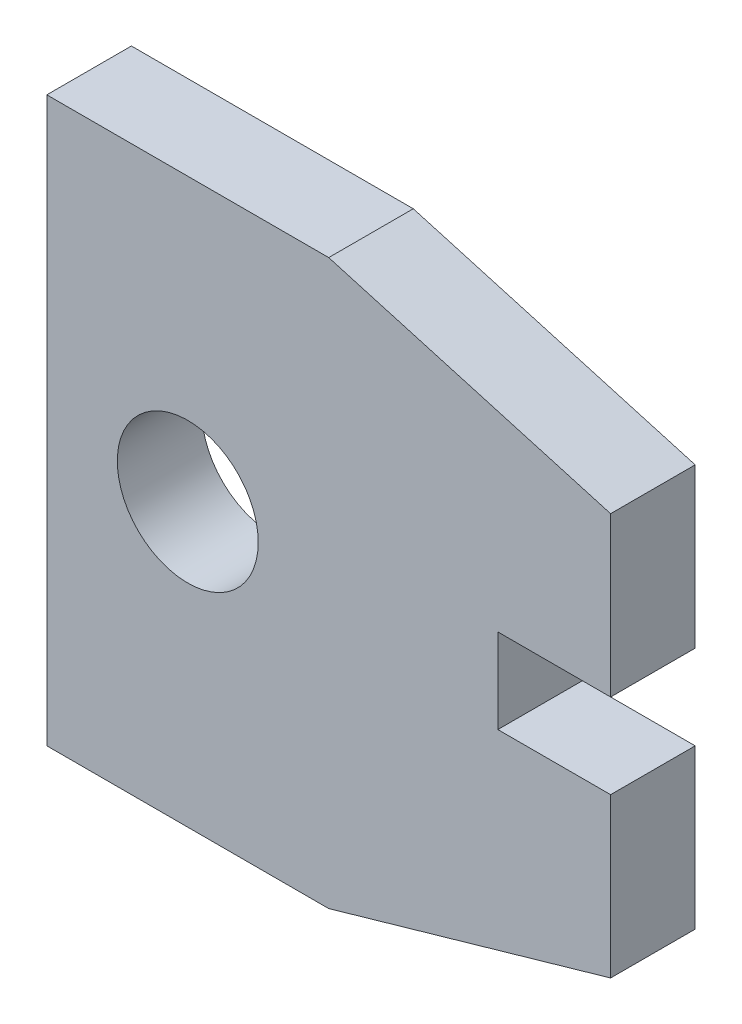
ISO-10303-21;
HEADER;
FILE_DESCRIPTION(('STEP AP214'),'2;1');
FILE_NAME('part.step','',(''),(''),'','','');
FILE_SCHEMA(('AUTOMOTIVE_DESIGN { 1 0 10303 214 1 1 1 1 }'));
ENDSEC;
DATA;
#1=APPLICATION_CONTEXT('core data for automotive mechanical design processes');
#2=APPLICATION_PROTOCOL_DEFINITION('international standard','automotive_design',2000,#1);
#3=PRODUCT_CONTEXT('',#1,'mechanical');
#4=PRODUCT('Part','Part','',(#3));
#5=PRODUCT_RELATED_PRODUCT_CATEGORY('part','',(#4));
#6=PRODUCT_DEFINITION_FORMATION('','',#4);
#7=PRODUCT_DEFINITION_CONTEXT('part definition',#1,'design');
#8=PRODUCT_DEFINITION('design','',#6,#7);
#9=PRODUCT_DEFINITION_SHAPE('','',#8);
#10=(LENGTH_UNIT() NAMED_UNIT(*) SI_UNIT(.MILLI.,.METRE.));
#11=(NAMED_UNIT(*) PLANE_ANGLE_UNIT() SI_UNIT($,.RADIAN.));
#12=(NAMED_UNIT(*) SI_UNIT($,.STERADIAN.) SOLID_ANGLE_UNIT());
#13=UNCERTAINTY_MEASURE_WITH_UNIT(LENGTH_MEASURE(1.E-05),#10,'distance_accuracy_value','');
#14=(GEOMETRIC_REPRESENTATION_CONTEXT(3) GLOBAL_UNCERTAINTY_ASSIGNED_CONTEXT((#13)) GLOBAL_UNIT_ASSIGNED_CONTEXT((#10,
#11,#12)) REPRESENTATION_CONTEXT('',''));
#15=CARTESIAN_POINT('',(0.,0.,0.));
#16=DIRECTION('',(0.,0.,1.));
#17=DIRECTION('',(1.,0.,0.));
#18=AXIS2_PLACEMENT_3D('',#15,#16,#17);
#19=CARTESIAN_POINT('',(0.,0.,3.));
#20=DIRECTION('',(0.,0.,1.));
#21=DIRECTION('',(1.,0.,0.));
#22=AXIS2_PLACEMENT_3D('',#19,#20,#21);
#23=PLANE('',#22);
#24=DIRECTION('',(0.,-1.,0.));
#25=VECTOR('',#24,1.);
#26=CARTESIAN_POINT('',(6.,1.5,3.));
#27=LINE('',#26,#25);
#28=CARTESIAN_POINT('',(6.,1.5,3.));
#29=VERTEX_POINT('',#28);
#30=CARTESIAN_POINT('',(6.,-1.5,3.));
#31=VERTEX_POINT('',#30);
#32=EDGE_CURVE('E206',#29,#31,#27,.T.);
#33=ORIENTED_EDGE('',*,*,#32,.F.);
#34=DIRECTION('',(-1.,0.,0.));
#35=VECTOR('',#34,1.);
#36=CARTESIAN_POINT('',(10.,1.5,3.));
#37=LINE('',#36,#35);
#38=CARTESIAN_POINT('',(10.,1.5,3.));
#39=VERTEX_POINT('',#38);
#40=EDGE_CURVE('E110',#39,#29,#37,.T.);
#41=ORIENTED_EDGE('',*,*,#40,.F.);
#42=DIRECTION('',(0.,1.,0.));
#43=VECTOR('',#42,1.);
#44=CARTESIAN_POINT('',(10.,7.13254614241191,3.));
#45=LINE('',#44,#43);
#46=CARTESIAN_POINT('',(10.,7.13254614241191,3.));
#47=VERTEX_POINT('',#46);
#48=EDGE_CURVE('E102',#39,#47,#45,.T.);
#49=ORIENTED_EDGE('',*,*,#48,.T.);
#50=DIRECTION('',(-0.961261695938318,0.275637355817,0.));
#51=VECTOR('',#50,1.);
#52=CARTESIAN_POINT('',(0.,10.,3.));
#53=LINE('',#52,#51);
#54=CARTESIAN_POINT('',(0.,10.,3.));
#55=VERTEX_POINT('',#54);
#56=EDGE_CURVE('E107',#47,#55,#53,.T.);
#57=ORIENTED_EDGE('',*,*,#56,.T.);
#58=DIRECTION('',(-1.,0.,0.));
#59=VECTOR('',#58,1.);
#60=CARTESIAN_POINT('',(-10.,10.,3.));
#61=LINE('',#60,#59);
#62=CARTESIAN_POINT('',(-10.,10.,3.));
#63=VERTEX_POINT('',#62);
#64=EDGE_CURVE('E56',#55,#63,#61,.T.);
#65=ORIENTED_EDGE('',*,*,#64,.T.);
#66=DIRECTION('',(0.,-1.,0.));
#67=VECTOR('',#66,1.);
#68=CARTESIAN_POINT('',(-10.,10.,3.));
#69=LINE('',#68,#67);
#70=CARTESIAN_POINT('',(-10.,-10.,3.));
#71=VERTEX_POINT('',#70);
#72=EDGE_CURVE('E147',#63,#71,#69,.T.);
#73=ORIENTED_EDGE('',*,*,#72,.T.);
#74=DIRECTION('',(1.,0.,0.));
#75=VECTOR('',#74,1.);
#76=CARTESIAN_POINT('',(-10.,-10.,3.));
#77=LINE('',#76,#75);
#78=CARTESIAN_POINT('',(0.,-10.,3.));
#79=VERTEX_POINT('',#78);
#80=EDGE_CURVE('E91',#71,#79,#77,.T.);
#81=ORIENTED_EDGE('',*,*,#80,.T.);
#82=DIRECTION('',(0.961261695938319,0.275637355817,0.));
#83=VECTOR('',#82,1.);
#84=CARTESIAN_POINT('',(0.,-10.,3.));
#85=LINE('',#84,#83);
#86=CARTESIAN_POINT('',(10.,-7.13254614241191,3.));
#87=VERTEX_POINT('',#86);
#88=EDGE_CURVE('E157',#79,#87,#85,.T.);
#89=ORIENTED_EDGE('',*,*,#88,.T.);
#90=DIRECTION('',(0.,1.,0.));
#91=VECTOR('',#90,1.);
#92=CARTESIAN_POINT('',(10.,-2.5,3.));
#93=LINE('',#92,#91);
#94=CARTESIAN_POINT('',(10.,-1.5,3.));
#95=VERTEX_POINT('',#94);
#96=EDGE_CURVE('E114',#87,#95,#93,.T.);
#97=ORIENTED_EDGE('',*,*,#96,.T.);
#98=DIRECTION('',(1.,0.,0.));
#99=VECTOR('',#98,1.);
#100=CARTESIAN_POINT('',(10.,-1.5,3.));
#101=LINE('',#100,#99);
#102=EDGE_CURVE('E179',#31,#95,#101,.T.);
#103=ORIENTED_EDGE('',*,*,#102,.F.);
#104=EDGE_LOOP('',(#33,#41,#49,#57,#65,#73,#81,#89,#97,#103));
#105=FACE_BOUND('',#104,.T.);
#106=CARTESIAN_POINT('',(-5.,0.,3.));
#107=DIRECTION('',(0.,0.,1.));
#108=DIRECTION('',(1.,0.,0.));
#109=AXIS2_PLACEMENT_3D('',#106,#107,#108);
#110=CIRCLE('',#109,2.5);
#111=CARTESIAN_POINT('',(-2.5,0.,3.));
#112=VERTEX_POINT('',#111);
#113=EDGE_CURVE('E136',#112,#112,#110,.T.);
#114=ORIENTED_EDGE('',*,*,#113,.F.);
#115=EDGE_LOOP('',(#114));
#116=FACE_BOUND('',#115,.T.);
#117=ADVANCED_FACE('F32',(#105,#116),#23,.T.);
#118=CARTESIAN_POINT('',(0.,0.,0.));
#119=DIRECTION('',(0.,0.,1.));
#120=DIRECTION('',(1.,0.,0.));
#121=AXIS2_PLACEMENT_3D('',#118,#119,#120);
#122=PLANE('',#121);
#123=DIRECTION('',(-1.,0.,0.));
#124=VECTOR('',#123,1.);
#125=CARTESIAN_POINT('',(10.,1.5,0.));
#126=LINE('',#125,#124);
#127=CARTESIAN_POINT('',(10.,1.5,0.));
#128=VERTEX_POINT('',#127);
#129=CARTESIAN_POINT('',(6.,1.5,0.));
#130=VERTEX_POINT('',#129);
#131=EDGE_CURVE('E181',#128,#130,#126,.T.);
#132=ORIENTED_EDGE('',*,*,#131,.T.);
#133=DIRECTION('',(0.,-1.,0.));
#134=VECTOR('',#133,1.);
#135=CARTESIAN_POINT('',(6.,1.5,0.));
#136=LINE('',#135,#134);
#137=CARTESIAN_POINT('',(6.,-1.5,0.));
#138=VERTEX_POINT('',#137);
#139=EDGE_CURVE('E47',#130,#138,#136,.T.);
#140=ORIENTED_EDGE('',*,*,#139,.T.);
#141=DIRECTION('',(1.,0.,0.));
#142=VECTOR('',#141,1.);
#143=CARTESIAN_POINT('',(10.,-1.5,0.));
#144=LINE('',#143,#142);
#145=CARTESIAN_POINT('',(10.,-1.5,0.));
#146=VERTEX_POINT('',#145);
#147=EDGE_CURVE('E164',#138,#146,#144,.T.);
#148=ORIENTED_EDGE('',*,*,#147,.T.);
#149=DIRECTION('',(0.,1.,0.));
#150=VECTOR('',#149,1.);
#151=CARTESIAN_POINT('',(10.,-2.5,0.));
#152=LINE('',#151,#150);
#153=CARTESIAN_POINT('',(10.,-7.13254614241191,0.));
#154=VERTEX_POINT('',#153);
#155=EDGE_CURVE('E140',#154,#146,#152,.T.);
#156=ORIENTED_EDGE('',*,*,#155,.F.);
#157=DIRECTION('',(0.961261695938319,0.275637355817,0.));
#158=VECTOR('',#157,1.);
#159=CARTESIAN_POINT('',(0.,-10.,0.));
#160=LINE('',#159,#158);
#161=CARTESIAN_POINT('',(0.,-10.,0.));
#162=VERTEX_POINT('',#161);
#163=EDGE_CURVE('E138',#162,#154,#160,.T.);
#164=ORIENTED_EDGE('',*,*,#163,.F.);
#165=DIRECTION('',(1.,0.,0.));
#166=VECTOR('',#165,1.);
#167=CARTESIAN_POINT('',(-10.,-10.,0.));
#168=LINE('',#167,#166);
#169=CARTESIAN_POINT('',(-10.,-10.,0.));
#170=VERTEX_POINT('',#169);
#171=EDGE_CURVE('E135',#170,#162,#168,.T.);
#172=ORIENTED_EDGE('',*,*,#171,.F.);
#173=DIRECTION('',(0.,-1.,0.));
#174=VECTOR('',#173,1.);
#175=CARTESIAN_POINT('',(-10.,10.,0.));
#176=LINE('',#175,#174);
#177=CARTESIAN_POINT('',(-10.,10.,0.));
#178=VERTEX_POINT('',#177);
#179=EDGE_CURVE('E132',#178,#170,#176,.T.);
#180=ORIENTED_EDGE('',*,*,#179,.F.);
#181=DIRECTION('',(-1.,0.,0.));
#182=VECTOR('',#181,1.);
#183=CARTESIAN_POINT('',(-10.,10.,0.));
#184=LINE('',#183,#182);
#185=CARTESIAN_POINT('',(0.,10.,0.));
#186=VERTEX_POINT('',#185);
#187=EDGE_CURVE('E83',#186,#178,#184,.T.);
#188=ORIENTED_EDGE('',*,*,#187,.F.);
#189=DIRECTION('',(-0.961261695938318,0.275637355817,0.));
#190=VECTOR('',#189,1.);
#191=CARTESIAN_POINT('',(0.,10.,0.));
#192=LINE('',#191,#190);
#193=CARTESIAN_POINT('',(10.,7.13254614241191,0.));
#194=VERTEX_POINT('',#193);
#195=EDGE_CURVE('E144',#194,#186,#192,.T.);
#196=ORIENTED_EDGE('',*,*,#195,.F.);
#197=DIRECTION('',(0.,1.,0.));
#198=VECTOR('',#197,1.);
#199=CARTESIAN_POINT('',(10.,7.13254614241191,0.));
#200=LINE('',#199,#198);
#201=EDGE_CURVE('E120',#128,#194,#200,.T.);
#202=ORIENTED_EDGE('',*,*,#201,.F.);
#203=EDGE_LOOP('',(#132,#140,#148,#156,#164,#172,#180,#188,#196,#202));
#204=FACE_BOUND('',#203,.T.);
#205=CARTESIAN_POINT('',(-5.,0.,0.));
#206=DIRECTION('',(0.,0.,1.));
#207=DIRECTION('',(1.,0.,0.));
#208=AXIS2_PLACEMENT_3D('',#205,#206,#207);
#209=CIRCLE('',#208,2.5);
#210=CARTESIAN_POINT('',(-2.5,0.,0.));
#211=VERTEX_POINT('',#210);
#212=EDGE_CURVE('E190',#211,#211,#209,.T.);
#213=ORIENTED_EDGE('',*,*,#212,.T.);
#214=EDGE_LOOP('',(#213));
#215=FACE_BOUND('',#214,.T.);
#216=ADVANCED_FACE('F159',(#204,#215),#122,.F.);
#217=CARTESIAN_POINT('',(-10.,10.,3.));
#218=DIRECTION('',(1.,0.,0.));
#219=DIRECTION('',(0.,1.,0.));
#220=AXIS2_PLACEMENT_3D('',#217,#218,#219);
#221=PLANE('',#220);
#222=ORIENTED_EDGE('',*,*,#179,.T.);
#223=DIRECTION('',(0.,0.,-1.));
#224=VECTOR('',#223,1.);
#225=CARTESIAN_POINT('',(-10.,-10.,3.));
#226=LINE('',#225,#224);
#227=EDGE_CURVE('E11',#71,#170,#226,.T.);
#228=ORIENTED_EDGE('',*,*,#227,.F.);
#229=ORIENTED_EDGE('',*,*,#72,.F.);
#230=DIRECTION('',(0.,0.,-1.));
#231=VECTOR('',#230,1.);
#232=CARTESIAN_POINT('',(-10.,10.,3.));
#233=LINE('',#232,#231);
#234=EDGE_CURVE('E128',#63,#178,#233,.T.);
#235=ORIENTED_EDGE('',*,*,#234,.T.);
#236=EDGE_LOOP('',(#222,#228,#229,#235));
#237=FACE_BOUND('',#236,.T.);
#238=ADVANCED_FACE('F34',(#237),#221,.F.);
#239=CARTESIAN_POINT('',(-10.,-10.,3.));
#240=DIRECTION('',(0.,1.,0.));
#241=DIRECTION('',(0.,0.,1.));
#242=AXIS2_PLACEMENT_3D('',#239,#240,#241);
#243=PLANE('',#242);
#244=ORIENTED_EDGE('',*,*,#171,.T.);
#245=DIRECTION('',(0.,0.,-1.));
#246=VECTOR('',#245,1.);
#247=CARTESIAN_POINT('',(0.,-10.,3.));
#248=LINE('',#247,#246);
#249=EDGE_CURVE('E40',#79,#162,#248,.T.);
#250=ORIENTED_EDGE('',*,*,#249,.F.);
#251=ORIENTED_EDGE('',*,*,#80,.F.);
#252=ORIENTED_EDGE('',*,*,#227,.T.);
#253=EDGE_LOOP('',(#244,#250,#251,#252));
#254=FACE_BOUND('',#253,.T.);
#255=ADVANCED_FACE('F222',(#254),#243,.F.);
#256=CARTESIAN_POINT('',(0.,-10.,3.));
#257=DIRECTION('',(-0.275637355817,0.961261695938319,0.));
#258=DIRECTION('',(-0.961261695938319,-0.275637355817,0.));
#259=AXIS2_PLACEMENT_3D('',#256,#257,#258);
#260=PLANE('',#259);
#261=ORIENTED_EDGE('',*,*,#163,.T.);
#262=DIRECTION('',(0.,0.,-1.));
#263=VECTOR('',#262,1.);
#264=CARTESIAN_POINT('',(10.,-7.13254614241191,3.));
#265=LINE('',#264,#263);
#266=EDGE_CURVE('E123',#87,#154,#265,.T.);
#267=ORIENTED_EDGE('',*,*,#266,.F.);
#268=ORIENTED_EDGE('',*,*,#88,.F.);
#269=ORIENTED_EDGE('',*,*,#249,.T.);
#270=EDGE_LOOP('',(#261,#267,#268,#269));
#271=FACE_BOUND('',#270,.T.);
#272=ADVANCED_FACE('F155',(#271),#260,.F.);
#273=CARTESIAN_POINT('',(10.,-2.5,3.));
#274=DIRECTION('',(-1.,0.,0.));
#275=DIRECTION('',(0.,-1.,0.));
#276=AXIS2_PLACEMENT_3D('',#273,#274,#275);
#277=PLANE('',#276);
#278=ORIENTED_EDGE('',*,*,#155,.T.);
#279=DIRECTION('',(0.,0.,-1.));
#280=VECTOR('',#279,1.);
#281=CARTESIAN_POINT('',(10.,-1.5,3.));
#282=LINE('',#281,#280);
#283=EDGE_CURVE('E171',#95,#146,#282,.T.);
#284=ORIENTED_EDGE('',*,*,#283,.F.);
#285=ORIENTED_EDGE('',*,*,#96,.F.);
#286=ORIENTED_EDGE('',*,*,#266,.T.);
#287=EDGE_LOOP('',(#278,#284,#285,#286));
#288=FACE_BOUND('',#287,.T.);
#289=ADVANCED_FACE('F168',(#288),#277,.F.);
#290=CARTESIAN_POINT('',(10.,7.13254614241191,3.));
#291=DIRECTION('',(-1.,0.,0.));
#292=DIRECTION('',(0.,-1.,0.));
#293=AXIS2_PLACEMENT_3D('',#290,#291,#292);
#294=PLANE('',#293);
#295=ORIENTED_EDGE('',*,*,#201,.T.);
#296=DIRECTION('',(0.,0.,-1.));
#297=VECTOR('',#296,1.);
#298=CARTESIAN_POINT('',(10.,7.13254614241191,3.));
#299=LINE('',#298,#297);
#300=EDGE_CURVE('E117',#47,#194,#299,.T.);
#301=ORIENTED_EDGE('',*,*,#300,.F.);
#302=ORIENTED_EDGE('',*,*,#48,.F.);
#303=DIRECTION('',(0.,0.,-1.));
#304=VECTOR('',#303,1.);
#305=CARTESIAN_POINT('',(10.,1.5,3.));
#306=LINE('',#305,#304);
#307=EDGE_CURVE('E187',#39,#128,#306,.T.);
#308=ORIENTED_EDGE('',*,*,#307,.T.);
#309=EDGE_LOOP('',(#295,#301,#302,#308));
#310=FACE_BOUND('',#309,.T.);
#311=ADVANCED_FACE('F118',(#310),#294,.F.);
#312=CARTESIAN_POINT('',(0.,10.,3.));
#313=DIRECTION('',(-0.275637355817,-0.961261695938319,0.));
#314=DIRECTION('',(0.961261695938319,-0.275637355817,0.));
#315=AXIS2_PLACEMENT_3D('',#312,#313,#314);
#316=PLANE('',#315);
#317=ORIENTED_EDGE('',*,*,#195,.T.);
#318=DIRECTION('',(0.,0.,-1.));
#319=VECTOR('',#318,1.);
#320=CARTESIAN_POINT('',(0.,10.,3.));
#321=LINE('',#320,#319);
#322=EDGE_CURVE('E124',#55,#186,#321,.T.);
#323=ORIENTED_EDGE('',*,*,#322,.F.);
#324=ORIENTED_EDGE('',*,*,#56,.F.);
#325=ORIENTED_EDGE('',*,*,#300,.T.);
#326=EDGE_LOOP('',(#317,#323,#324,#325));
#327=FACE_BOUND('',#326,.T.);
#328=ADVANCED_FACE('F126',(#327),#316,.F.);
#329=CARTESIAN_POINT('',(-10.,10.,3.));
#330=DIRECTION('',(0.,-1.,0.));
#331=DIRECTION('',(0.,0.,-1.));
#332=AXIS2_PLACEMENT_3D('',#329,#330,#331);
#333=PLANE('',#332);
#334=ORIENTED_EDGE('',*,*,#187,.T.);
#335=ORIENTED_EDGE('',*,*,#234,.F.);
#336=ORIENTED_EDGE('',*,*,#64,.F.);
#337=ORIENTED_EDGE('',*,*,#322,.T.);
#338=EDGE_LOOP('',(#334,#335,#336,#337));
#339=FACE_BOUND('',#338,.T.);
#340=ADVANCED_FACE('F218',(#339),#333,.F.);
#341=CARTESIAN_POINT('',(-5.,0.,3.));
#342=DIRECTION('',(0.,0.,-1.));
#343=DIRECTION('',(-1.,0.,0.));
#344=AXIS2_PLACEMENT_3D('',#341,#342,#343);
#345=CYLINDRICAL_SURFACE('',#344,2.5);
#346=ORIENTED_EDGE('',*,*,#113,.T.);
#347=EDGE_LOOP('',(#346));
#348=FACE_BOUND('',#347,.T.);
#349=ORIENTED_EDGE('',*,*,#212,.F.);
#350=EDGE_LOOP('',(#349));
#351=FACE_BOUND('',#350,.T.);
#352=ADVANCED_FACE('F236',(#348,#351),#345,.F.);
#353=CARTESIAN_POINT('',(10.,1.5,3.));
#354=DIRECTION('',(0.,-1.,0.));
#355=DIRECTION('',(0.,0.,-1.));
#356=AXIS2_PLACEMENT_3D('',#353,#354,#355);
#357=PLANE('',#356);
#358=DIRECTION('',(0.,0.,-1.));
#359=VECTOR('',#358,1.);
#360=CARTESIAN_POINT('',(6.,1.5,3.));
#361=LINE('',#360,#359);
#362=EDGE_CURVE('E210',#29,#130,#361,.T.);
#363=ORIENTED_EDGE('',*,*,#362,.T.);
#364=ORIENTED_EDGE('',*,*,#131,.F.);
#365=ORIENTED_EDGE('',*,*,#307,.F.);
#366=ORIENTED_EDGE('',*,*,#40,.T.);
#367=EDGE_LOOP('',(#363,#364,#365,#366));
#368=FACE_BOUND('',#367,.T.);
#369=ADVANCED_FACE('F217',(#368),#357,.T.);
#370=CARTESIAN_POINT('',(10.,-1.5,3.));
#371=DIRECTION('',(0.,1.,0.));
#372=DIRECTION('',(0.,0.,1.));
#373=AXIS2_PLACEMENT_3D('',#370,#371,#372);
#374=PLANE('',#373);
#375=DIRECTION('',(0.,0.,-1.));
#376=VECTOR('',#375,1.);
#377=CARTESIAN_POINT('',(6.,-1.5,3.));
#378=LINE('',#377,#376);
#379=EDGE_CURVE('E208',#31,#138,#378,.T.);
#380=ORIENTED_EDGE('',*,*,#379,.F.);
#381=ORIENTED_EDGE('',*,*,#102,.T.);
#382=ORIENTED_EDGE('',*,*,#283,.T.);
#383=ORIENTED_EDGE('',*,*,#147,.F.);
#384=EDGE_LOOP('',(#380,#381,#382,#383));
#385=FACE_BOUND('',#384,.T.);
#386=ADVANCED_FACE('F177',(#385),#374,.T.);
#387=CARTESIAN_POINT('',(6.,1.5,3.));
#388=DIRECTION('',(1.,0.,0.));
#389=DIRECTION('',(0.,0.,-1.));
#390=AXIS2_PLACEMENT_3D('',#387,#388,#389);
#391=PLANE('',#390);
#392=ORIENTED_EDGE('',*,*,#139,.F.);
#393=ORIENTED_EDGE('',*,*,#362,.F.);
#394=ORIENTED_EDGE('',*,*,#32,.T.);
#395=ORIENTED_EDGE('',*,*,#379,.T.);
#396=EDGE_LOOP('',(#392,#393,#394,#395));
#397=FACE_BOUND('',#396,.T.);
#398=ADVANCED_FACE('F207',(#397),#391,.T.);
#399=CLOSED_SHELL('',(#117,#216,#238,#255,#272,#289,#311,#328,#340,#352,#369,#386,#398));
#400=MANIFOLD_SOLID_BREP('B2',#399);
#401=ADVANCED_BREP_SHAPE_REPRESENTATION('',(#18,#400),#14);
#402=SHAPE_DEFINITION_REPRESENTATION(#9,#401);
ENDSEC;
END-ISO-10303-21;
